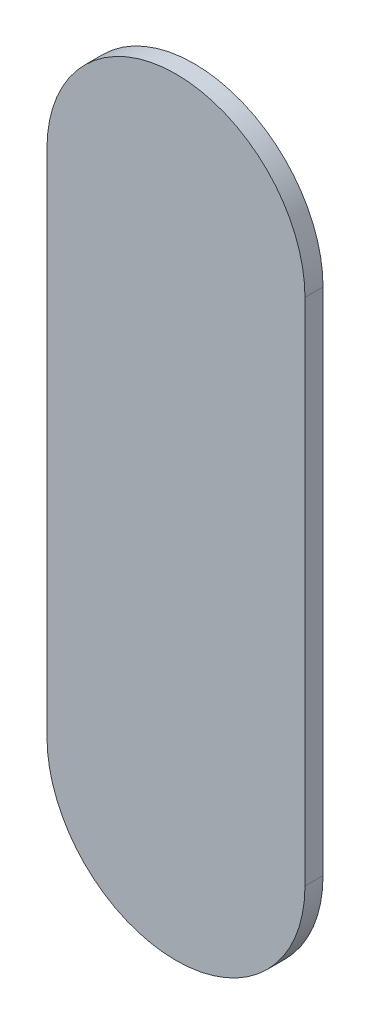
ISO-10303-21;
HEADER;
FILE_DESCRIPTION(('STEP AP214'),'2;1');
FILE_NAME('part.step','',(''),(''),'','','');
FILE_SCHEMA(('AUTOMOTIVE_DESIGN { 1 0 10303 214 1 1 1 1 }'));
ENDSEC;
DATA;
#1=APPLICATION_CONTEXT('core data for automotive mechanical design processes');
#2=APPLICATION_PROTOCOL_DEFINITION('international standard','automotive_design',2000,#1);
#3=PRODUCT_CONTEXT('',#1,'mechanical');
#4=PRODUCT('Part','Part','',(#3));
#5=PRODUCT_RELATED_PRODUCT_CATEGORY('part','',(#4));
#6=PRODUCT_DEFINITION_FORMATION('','',#4);
#7=PRODUCT_DEFINITION_CONTEXT('part definition',#1,'design');
#8=PRODUCT_DEFINITION('design','',#6,#7);
#9=PRODUCT_DEFINITION_SHAPE('','',#8);
#10=(LENGTH_UNIT() NAMED_UNIT(*) SI_UNIT(.MILLI.,.METRE.));
#11=(NAMED_UNIT(*) PLANE_ANGLE_UNIT() SI_UNIT($,.RADIAN.));
#12=(NAMED_UNIT(*) SI_UNIT($,.STERADIAN.) SOLID_ANGLE_UNIT());
#13=UNCERTAINTY_MEASURE_WITH_UNIT(LENGTH_MEASURE(1.E-05),#10,'distance_accuracy_value','');
#14=(GEOMETRIC_REPRESENTATION_CONTEXT(3) GLOBAL_UNCERTAINTY_ASSIGNED_CONTEXT((#13)) GLOBAL_UNIT_ASSIGNED_CONTEXT((#10,
#11,#12)) REPRESENTATION_CONTEXT('',''));
#15=CARTESIAN_POINT('',(0.,0.,0.));
#16=DIRECTION('',(0.,0.,1.));
#17=DIRECTION('',(1.,0.,0.));
#18=AXIS2_PLACEMENT_3D('',#15,#16,#17);
#19=CARTESIAN_POINT('',(128.09,-111.51,1.635));
#20=DIRECTION('',(0.,0.,1.));
#21=DIRECTION('',(1.,0.,0.));
#22=AXIS2_PLACEMENT_3D('',#19,#20,#21);
#23=PLANE('',#22);
#24=DIRECTION('',(0.,-1.,0.));
#25=VECTOR('',#24,1.);
#26=CARTESIAN_POINT('',(128.09,-111.51,1.635));
#27=LINE('',#26,#25);
#28=CARTESIAN_POINT('',(128.09,-111.51,1.635));
#29=VERTEX_POINT('',#28);
#30=CARTESIAN_POINT('',(128.09,-112.498,1.635));
#31=VERTEX_POINT('',#30);
#32=EDGE_CURVE('E80',#29,#31,#27,.T.);
#33=ORIENTED_EDGE('',*,*,#32,.T.);
#34=CARTESIAN_POINT('',(128.34,-112.498,1.635));
#35=DIRECTION('',(0.,0.,1.));
#36=DIRECTION('',(-1.,0.,0.));
#37=AXIS2_PLACEMENT_3D('',#34,#35,#36);
#38=CIRCLE('',#37,0.25);
#39=CARTESIAN_POINT('',(128.59,-112.498,1.635));
#40=VERTEX_POINT('',#39);
#41=EDGE_CURVE('E100',#31,#40,#38,.T.);
#42=ORIENTED_EDGE('',*,*,#41,.T.);
#43=DIRECTION('',(0.,1.,0.));
#44=VECTOR('',#43,1.);
#45=CARTESIAN_POINT('',(128.59,-112.498,1.635));
#46=LINE('',#45,#44);
#47=CARTESIAN_POINT('',(128.59,-111.51,1.635));
#48=VERTEX_POINT('',#47);
#49=EDGE_CURVE('E73',#40,#48,#46,.T.);
#50=ORIENTED_EDGE('',*,*,#49,.T.);
#51=CARTESIAN_POINT('',(128.34,-111.51,1.635));
#52=DIRECTION('',(0.,0.,1.));
#53=DIRECTION('',(1.,0.,0.));
#54=AXIS2_PLACEMENT_3D('',#51,#52,#53);
#55=CIRCLE('',#54,0.25);
#56=EDGE_CURVE('E11',#48,#29,#55,.T.);
#57=ORIENTED_EDGE('',*,*,#56,.T.);
#58=EDGE_LOOP('',(#33,#42,#50,#57));
#59=FACE_BOUND('',#58,.T.);
#60=ADVANCED_FACE('F17',(#59),#23,.T.);
#61=CARTESIAN_POINT('',(128.09,-111.51,1.6));
#62=DIRECTION('',(0.,0.,1.));
#63=DIRECTION('',(1.,0.,0.));
#64=AXIS2_PLACEMENT_3D('',#61,#62,#63);
#65=PLANE('',#64);
#66=CARTESIAN_POINT('',(128.34,-111.51,1.6));
#67=DIRECTION('',(0.,0.,1.));
#68=DIRECTION('',(1.,0.,0.));
#69=AXIS2_PLACEMENT_3D('',#66,#67,#68);
#70=CIRCLE('',#69,0.25);
#71=CARTESIAN_POINT('',(128.59,-111.51,1.6));
#72=VERTEX_POINT('',#71);
#73=CARTESIAN_POINT('',(128.09,-111.51,1.6));
#74=VERTEX_POINT('',#73);
#75=EDGE_CURVE('E20',#72,#74,#70,.T.);
#76=ORIENTED_EDGE('',*,*,#75,.F.);
#77=DIRECTION('',(0.,1.,0.));
#78=VECTOR('',#77,1.);
#79=CARTESIAN_POINT('',(128.59,-112.498,1.6));
#80=LINE('',#79,#78);
#81=CARTESIAN_POINT('',(128.59,-112.498,1.6));
#82=VERTEX_POINT('',#81);
#83=EDGE_CURVE('E107',#82,#72,#80,.T.);
#84=ORIENTED_EDGE('',*,*,#83,.F.);
#85=CARTESIAN_POINT('',(128.34,-112.498,1.6));
#86=DIRECTION('',(0.,0.,1.));
#87=DIRECTION('',(-1.,0.,0.));
#88=AXIS2_PLACEMENT_3D('',#85,#86,#87);
#89=CIRCLE('',#88,0.25);
#90=CARTESIAN_POINT('',(128.09,-112.498,1.6));
#91=VERTEX_POINT('',#90);
#92=EDGE_CURVE('E82',#91,#82,#89,.T.);
#93=ORIENTED_EDGE('',*,*,#92,.F.);
#94=DIRECTION('',(0.,-1.,0.));
#95=VECTOR('',#94,1.);
#96=CARTESIAN_POINT('',(128.09,-111.51,1.6));
#97=LINE('',#96,#95);
#98=EDGE_CURVE('E78',#74,#91,#97,.T.);
#99=ORIENTED_EDGE('',*,*,#98,.F.);
#100=EDGE_LOOP('',(#76,#84,#93,#99));
#101=FACE_BOUND('',#100,.T.);
#102=ADVANCED_FACE('F84',(#101),#65,.F.);
#103=CARTESIAN_POINT('',(128.34,-111.51,1.6));
#104=DIRECTION('',(0.,0.,-1.));
#105=DIRECTION('',(1.,0.,0.));
#106=AXIS2_PLACEMENT_3D('',#103,#104,#105);
#107=CYLINDRICAL_SURFACE('',#106,0.25);
#108=ORIENTED_EDGE('',*,*,#75,.T.);
#109=DIRECTION('',(0.,0.,1.));
#110=VECTOR('',#109,1.);
#111=CARTESIAN_POINT('',(128.09,-111.51,1.6));
#112=LINE('',#111,#110);
#113=EDGE_CURVE('E65',#74,#29,#112,.T.);
#114=ORIENTED_EDGE('',*,*,#113,.T.);
#115=ORIENTED_EDGE('',*,*,#56,.F.);
#116=DIRECTION('',(0.,0.,1.));
#117=VECTOR('',#116,1.);
#118=CARTESIAN_POINT('',(128.59,-111.51,1.6));
#119=LINE('',#118,#117);
#120=EDGE_CURVE('E68',#72,#48,#119,.T.);
#121=ORIENTED_EDGE('',*,*,#120,.F.);
#122=EDGE_LOOP('',(#108,#114,#115,#121));
#123=FACE_BOUND('',#122,.T.);
#124=ADVANCED_FACE('F64',(#123),#107,.T.);
#125=CARTESIAN_POINT('',(128.59,-112.498,1.6));
#126=DIRECTION('',(-1.,0.,0.));
#127=DIRECTION('',(0.,0.,1.));
#128=AXIS2_PLACEMENT_3D('',#125,#126,#127);
#129=PLANE('',#128);
#130=ORIENTED_EDGE('',*,*,#83,.T.);
#131=ORIENTED_EDGE('',*,*,#120,.T.);
#132=ORIENTED_EDGE('',*,*,#49,.F.);
#133=DIRECTION('',(0.,0.,1.));
#134=VECTOR('',#133,1.);
#135=CARTESIAN_POINT('',(128.59,-112.498,1.6));
#136=LINE('',#135,#134);
#137=EDGE_CURVE('E97',#82,#40,#136,.T.);
#138=ORIENTED_EDGE('',*,*,#137,.F.);
#139=EDGE_LOOP('',(#130,#131,#132,#138));
#140=FACE_BOUND('',#139,.T.);
#141=ADVANCED_FACE('F117',(#140),#129,.F.);
#142=CARTESIAN_POINT('',(128.34,-112.498,1.6));
#143=DIRECTION('',(0.,0.,-1.));
#144=DIRECTION('',(-1.,0.,0.));
#145=AXIS2_PLACEMENT_3D('',#142,#143,#144);
#146=CYLINDRICAL_SURFACE('',#145,0.25);
#147=ORIENTED_EDGE('',*,*,#92,.T.);
#148=ORIENTED_EDGE('',*,*,#137,.T.);
#149=ORIENTED_EDGE('',*,*,#41,.F.);
#150=DIRECTION('',(0.,0.,1.));
#151=VECTOR('',#150,1.);
#152=CARTESIAN_POINT('',(128.09,-112.498,1.6));
#153=LINE('',#152,#151);
#154=EDGE_CURVE('E88',#91,#31,#153,.T.);
#155=ORIENTED_EDGE('',*,*,#154,.F.);
#156=EDGE_LOOP('',(#147,#148,#149,#155));
#157=FACE_BOUND('',#156,.T.);
#158=ADVANCED_FACE('F119',(#157),#146,.T.);
#159=CARTESIAN_POINT('',(128.09,-111.51,1.6));
#160=DIRECTION('',(1.,0.,0.));
#161=DIRECTION('',(0.,1.,0.));
#162=AXIS2_PLACEMENT_3D('',#159,#160,#161);
#163=PLANE('',#162);
#164=ORIENTED_EDGE('',*,*,#98,.T.);
#165=ORIENTED_EDGE('',*,*,#154,.T.);
#166=ORIENTED_EDGE('',*,*,#32,.F.);
#167=ORIENTED_EDGE('',*,*,#113,.F.);
#168=EDGE_LOOP('',(#164,#165,#166,#167));
#169=FACE_BOUND('',#168,.T.);
#170=ADVANCED_FACE('F76',(#169),#163,.F.);
#171=CLOSED_SHELL('',(#60,#102,#124,#141,#158,#170));
#172=MANIFOLD_SOLID_BREP('B1',#171);
#173=ADVANCED_BREP_SHAPE_REPRESENTATION('',(#18,#172),#14);
#174=SHAPE_DEFINITION_REPRESENTATION(#9,#173);
ENDSEC;
END-ISO-10303-21;
